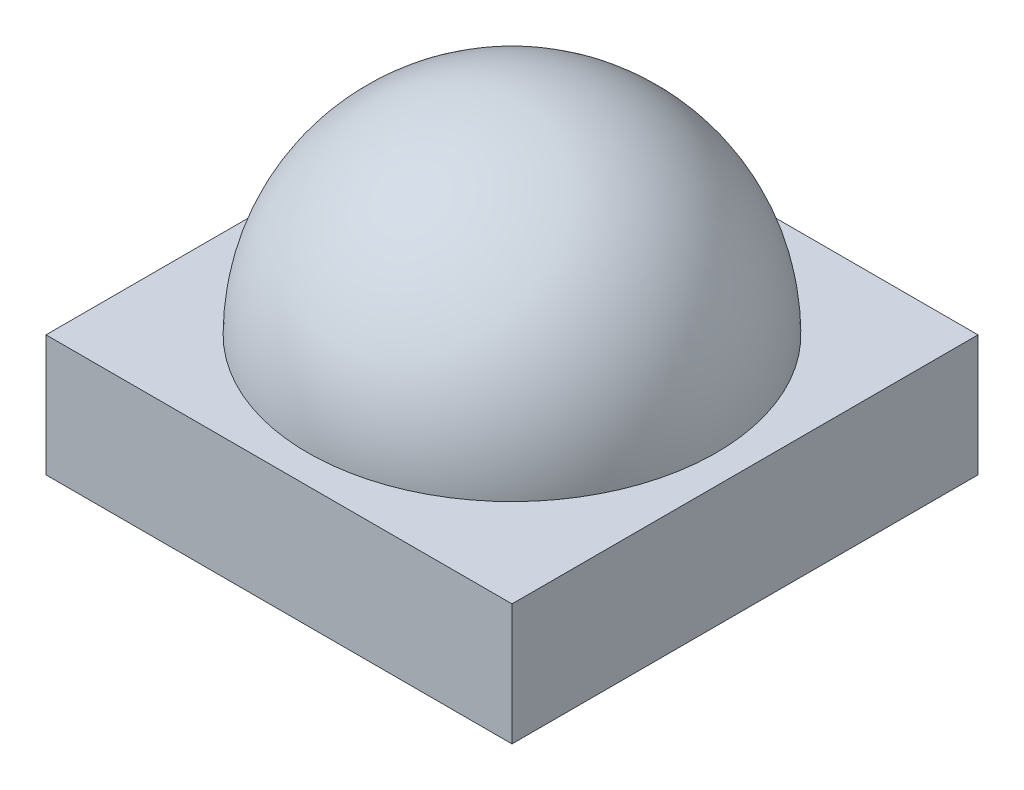
ISO-10303-21;
HEADER;
FILE_DESCRIPTION(('STEP AP214'),'2;1');
FILE_NAME('part.step','',(''),(''),'','','');
FILE_SCHEMA(('AUTOMOTIVE_DESIGN { 1 0 10303 214 1 1 1 1 }'));
ENDSEC;
DATA;
#1=APPLICATION_CONTEXT('core data for automotive mechanical design processes');
#2=APPLICATION_PROTOCOL_DEFINITION('international standard','automotive_design',2000,#1);
#3=PRODUCT_CONTEXT('',#1,'mechanical');
#4=PRODUCT('Part','Part','',(#3));
#5=PRODUCT_RELATED_PRODUCT_CATEGORY('part','',(#4));
#6=PRODUCT_DEFINITION_FORMATION('','',#4);
#7=PRODUCT_DEFINITION_CONTEXT('part definition',#1,'design');
#8=PRODUCT_DEFINITION('design','',#6,#7);
#9=PRODUCT_DEFINITION_SHAPE('','',#8);
#10=(LENGTH_UNIT() NAMED_UNIT(*) SI_UNIT(.MILLI.,.METRE.));
#11=(NAMED_UNIT(*) PLANE_ANGLE_UNIT() SI_UNIT($,.RADIAN.));
#12=(NAMED_UNIT(*) SI_UNIT($,.STERADIAN.) SOLID_ANGLE_UNIT());
#13=UNCERTAINTY_MEASURE_WITH_UNIT(LENGTH_MEASURE(1.E-05),#10,'distance_accuracy_value','');
#14=(GEOMETRIC_REPRESENTATION_CONTEXT(3) GLOBAL_UNCERTAINTY_ASSIGNED_CONTEXT((#13)) GLOBAL_UNIT_ASSIGNED_CONTEXT((#10,
#11,#12)) REPRESENTATION_CONTEXT('',''));
#15=CARTESIAN_POINT('',(0.,0.,0.));
#16=DIRECTION('',(0.,0.,1.));
#17=DIRECTION('',(1.,0.,0.));
#18=AXIS2_PLACEMENT_3D('',#15,#16,#17);
#19=CARTESIAN_POINT('',(1.82499999999999,0.95,1.82499999999999));
#20=DIRECTION('',(-1.,0.,0.));
#21=DIRECTION('',(0.,0.,1.));
#22=AXIS2_PLACEMENT_3D('',#19,#20,#21);
#23=PLANE('',#22);
#24=DIRECTION('',(0.,0.,-1.));
#25=VECTOR('',#24,1.);
#26=CARTESIAN_POINT('',(1.82499999999999,0.,1.82499999999999));
#27=LINE('',#26,#25);
#28=CARTESIAN_POINT('',(1.82499999999999,0.,1.82499999999999));
#29=VERTEX_POINT('',#28);
#30=CARTESIAN_POINT('',(1.82499999999999,0.,-1.82500000000001));
#31=VERTEX_POINT('',#30);
#32=EDGE_CURVE('E105',#29,#31,#27,.T.);
#33=ORIENTED_EDGE('',*,*,#32,.T.);
#34=DIRECTION('',(0.,-1.,0.));
#35=VECTOR('',#34,1.);
#36=CARTESIAN_POINT('',(1.82499999999999,0.95,-1.82500000000001));
#37=LINE('',#36,#35);
#38=CARTESIAN_POINT('',(1.82499999999999,0.95,-1.82500000000001));
#39=VERTEX_POINT('',#38);
#40=EDGE_CURVE('E47',#39,#31,#37,.T.);
#41=ORIENTED_EDGE('',*,*,#40,.F.);
#42=DIRECTION('',(0.,0.,-1.));
#43=VECTOR('',#42,1.);
#44=CARTESIAN_POINT('',(1.82499999999999,0.95,1.82499999999999));
#45=LINE('',#44,#43);
#46=CARTESIAN_POINT('',(1.82499999999999,0.95,1.82499999999999));
#47=VERTEX_POINT('',#46);
#48=EDGE_CURVE('E91',#47,#39,#45,.T.);
#49=ORIENTED_EDGE('',*,*,#48,.F.);
#50=DIRECTION('',(0.,-1.,0.));
#51=VECTOR('',#50,1.);
#52=CARTESIAN_POINT('',(1.82499999999999,0.95,1.82499999999999));
#53=LINE('',#52,#51);
#54=EDGE_CURVE('E101',#47,#29,#53,.T.);
#55=ORIENTED_EDGE('',*,*,#54,.T.);
#56=EDGE_LOOP('',(#33,#41,#49,#55));
#57=FACE_BOUND('',#56,.T.);
#58=ADVANCED_FACE('F39',(#57),#23,.F.);
#59=CARTESIAN_POINT('',(-1.82500000000001,0.95,-1.82500000000001));
#60=DIRECTION('',(0.,0.,1.));
#61=DIRECTION('',(1.,0.,0.));
#62=AXIS2_PLACEMENT_3D('',#59,#60,#61);
#63=PLANE('',#62);
#64=DIRECTION('',(-1.,0.,0.));
#65=VECTOR('',#64,1.);
#66=CARTESIAN_POINT('',(-1.82500000000001,0.,-1.82500000000001));
#67=LINE('',#66,#65);
#68=CARTESIAN_POINT('',(-1.82500000000001,0.,-1.82500000000001));
#69=VERTEX_POINT('',#68);
#70=EDGE_CURVE('E96',#31,#69,#67,.T.);
#71=ORIENTED_EDGE('',*,*,#70,.T.);
#72=DIRECTION('',(0.,-1.,0.));
#73=VECTOR('',#72,1.);
#74=CARTESIAN_POINT('',(-1.82500000000001,0.95,-1.82500000000001));
#75=LINE('',#74,#73);
#76=CARTESIAN_POINT('',(-1.82500000000001,0.95,-1.82500000000001));
#77=VERTEX_POINT('',#76);
#78=EDGE_CURVE('E94',#77,#69,#75,.T.);
#79=ORIENTED_EDGE('',*,*,#78,.F.);
#80=DIRECTION('',(-1.,0.,0.));
#81=VECTOR('',#80,1.);
#82=CARTESIAN_POINT('',(-1.82500000000001,0.95,-1.82500000000001));
#83=LINE('',#82,#81);
#84=EDGE_CURVE('E86',#39,#77,#83,.T.);
#85=ORIENTED_EDGE('',*,*,#84,.F.);
#86=ORIENTED_EDGE('',*,*,#40,.T.);
#87=EDGE_LOOP('',(#71,#79,#85,#86));
#88=FACE_BOUND('',#87,.T.);
#89=ADVANCED_FACE('F95',(#88),#63,.F.);
#90=CARTESIAN_POINT('',(-1.82500000000001,0.95,1.82499999999999));
#91=DIRECTION('',(1.,0.,0.));
#92=DIRECTION('',(0.,0.,-1.));
#93=AXIS2_PLACEMENT_3D('',#90,#91,#92);
#94=PLANE('',#93);
#95=DIRECTION('',(0.,0.,1.));
#96=VECTOR('',#95,1.);
#97=CARTESIAN_POINT('',(-1.82500000000001,0.,1.82499999999999));
#98=LINE('',#97,#96);
#99=CARTESIAN_POINT('',(-1.82500000000001,0.,1.82499999999999));
#100=VERTEX_POINT('',#99);
#101=EDGE_CURVE('E72',#69,#100,#98,.T.);
#102=ORIENTED_EDGE('',*,*,#101,.T.);
#103=DIRECTION('',(0.,-1.,0.));
#104=VECTOR('',#103,1.);
#105=CARTESIAN_POINT('',(-1.82500000000001,0.95,1.82499999999999));
#106=LINE('',#105,#104);
#107=CARTESIAN_POINT('',(-1.82500000000001,0.95,1.82499999999999));
#108=VERTEX_POINT('',#107);
#109=EDGE_CURVE('E97',#108,#100,#106,.T.);
#110=ORIENTED_EDGE('',*,*,#109,.F.);
#111=DIRECTION('',(0.,0.,1.));
#112=VECTOR('',#111,1.);
#113=CARTESIAN_POINT('',(-1.82500000000001,0.95,1.82499999999999));
#114=LINE('',#113,#112);
#115=EDGE_CURVE('E89',#77,#108,#114,.T.);
#116=ORIENTED_EDGE('',*,*,#115,.F.);
#117=ORIENTED_EDGE('',*,*,#78,.T.);
#118=EDGE_LOOP('',(#102,#110,#116,#117));
#119=FACE_BOUND('',#118,.T.);
#120=ADVANCED_FACE('F99',(#119),#94,.F.);
#121=CARTESIAN_POINT('',(-1.82500000000001,0.95,1.82499999999999));
#122=DIRECTION('',(0.,0.,-1.));
#123=DIRECTION('',(-1.,0.,0.));
#124=AXIS2_PLACEMENT_3D('',#121,#122,#123);
#125=PLANE('',#124);
#126=DIRECTION('',(1.,0.,0.));
#127=VECTOR('',#126,1.);
#128=CARTESIAN_POINT('',(-1.82500000000001,0.,1.82499999999999));
#129=LINE('',#128,#127);
#130=EDGE_CURVE('E78',#100,#29,#129,.T.);
#131=ORIENTED_EDGE('',*,*,#130,.T.);
#132=ORIENTED_EDGE('',*,*,#54,.F.);
#133=DIRECTION('',(1.,0.,0.));
#134=VECTOR('',#133,1.);
#135=CARTESIAN_POINT('',(-1.82500000000001,0.95,1.82499999999999));
#136=LINE('',#135,#134);
#137=EDGE_CURVE('E55',#108,#47,#136,.T.);
#138=ORIENTED_EDGE('',*,*,#137,.F.);
#139=ORIENTED_EDGE('',*,*,#109,.T.);
#140=EDGE_LOOP('',(#131,#132,#138,#139));
#141=FACE_BOUND('',#140,.T.);
#142=ADVANCED_FACE('F125',(#141),#125,.F.);
#143=CARTESIAN_POINT('',(0.,0.95,0.));
#144=DIRECTION('',(0.,-1.,0.));
#145=DIRECTION('',(0.,0.,-1.));
#146=AXIS2_PLACEMENT_3D('',#143,#144,#145);
#147=PLANE('',#146);
#148=CARTESIAN_POINT('',(0.,0.95,0.));
#149=DIRECTION('',(0.,-1.,0.));
#150=DIRECTION('',(0.,0.,-1.));
#151=AXIS2_PLACEMENT_3D('',#148,#149,#150);
#152=CIRCLE('',#151,1.6);
#153=CARTESIAN_POINT('',(0.,0.95,-1.6));
#154=VERTEX_POINT('',#153);
#155=EDGE_CURVE('E11',#154,#154,#152,.F.);
#156=ORIENTED_EDGE('',*,*,#155,.F.);
#157=EDGE_LOOP('',(#156));
#158=FACE_BOUND('',#157,.T.);
#159=ORIENTED_EDGE('',*,*,#48,.T.);
#160=ORIENTED_EDGE('',*,*,#84,.T.);
#161=ORIENTED_EDGE('',*,*,#115,.T.);
#162=ORIENTED_EDGE('',*,*,#137,.T.);
#163=EDGE_LOOP('',(#159,#160,#161,#162));
#164=FACE_BOUND('',#163,.T.);
#165=ADVANCED_FACE('F87',(#158,#164),#147,.F.);
#166=CARTESIAN_POINT('',(0.,0.,0.));
#167=DIRECTION('',(0.,-1.,0.));
#168=DIRECTION('',(0.,0.,-1.));
#169=AXIS2_PLACEMENT_3D('',#166,#167,#168);
#170=PLANE('',#169);
#171=ORIENTED_EDGE('',*,*,#32,.F.);
#172=ORIENTED_EDGE('',*,*,#130,.F.);
#173=ORIENTED_EDGE('',*,*,#101,.F.);
#174=ORIENTED_EDGE('',*,*,#70,.F.);
#175=EDGE_LOOP('',(#171,#172,#173,#174));
#176=FACE_BOUND('',#175,.T.);
#177=ADVANCED_FACE('F115',(#176),#170,.T.);
#178=CARTESIAN_POINT('',(0.,0.95,0.));
#179=DIRECTION('',(0.,0.,-1.));
#180=DIRECTION('',(-1.,0.,0.));
#181=AXIS2_PLACEMENT_3D('',#178,#179,#180);
#182=SPHERICAL_SURFACE('',#181,1.6);
#183=CARTESIAN_POINT('',(0.,0.95,0.));
#184=DIRECTION('',(0.,-1.,0.));
#185=DIRECTION('',(0.,0.,-1.));
#186=AXIS2_PLACEMENT_3D('',#183,#184,#185);
#187=SPHERICAL_SURFACE('',#186,1.6);
#188=ORIENTED_EDGE('',*,*,#155,.T.);
#189=EDGE_LOOP('',(#188));
#190=FACE_BOUND('',#189,.T.);
#191=ADVANCED_FACE('F117',(#190),#187,.T.);
#192=CLOSED_SHELL('',(#58,#89,#120,#142,#165,#177,#191));
#193=MANIFOLD_SOLID_BREP('B2',#192);
#194=ADVANCED_BREP_SHAPE_REPRESENTATION('',(#18,#193),#14);
#195=SHAPE_DEFINITION_REPRESENTATION(#9,#194);
ENDSEC;
END-ISO-10303-21;
